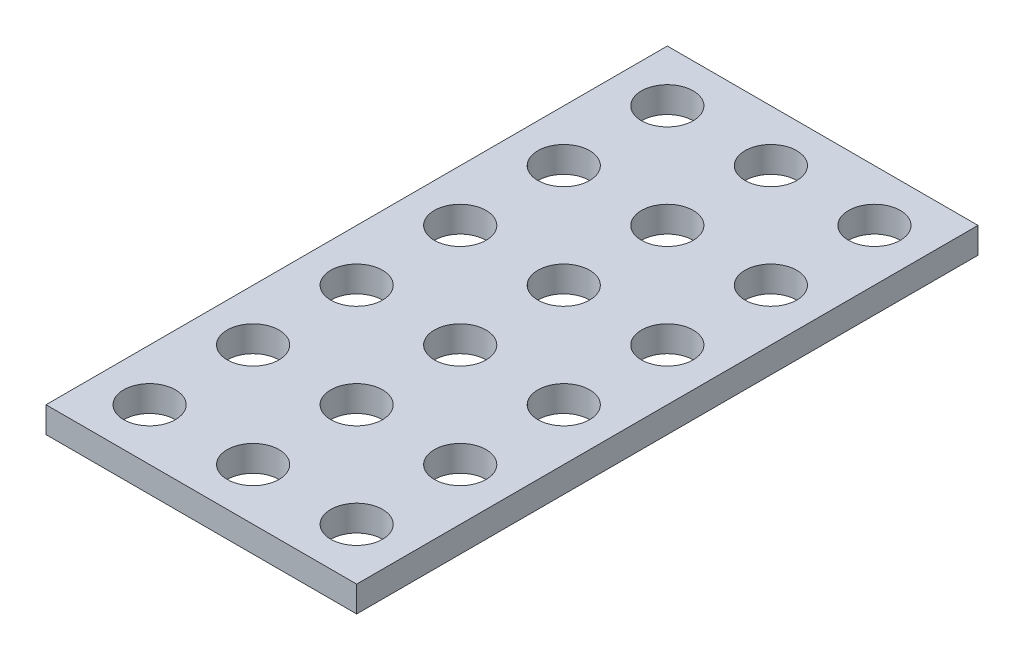
ISO-10303-21;
HEADER;
FILE_DESCRIPTION(('STEP AP214'),'2;1');
FILE_NAME('part.step','',(''),(''),'','','');
FILE_SCHEMA(('AUTOMOTIVE_DESIGN { 1 0 10303 214 1 1 1 1 }'));
ENDSEC;
DATA;
#1=APPLICATION_CONTEXT('core data for automotive mechanical design processes');
#2=APPLICATION_PROTOCOL_DEFINITION('international standard','automotive_design',2000,#1);
#3=PRODUCT_CONTEXT('',#1,'mechanical');
#4=PRODUCT('Part','Part','',(#3));
#5=PRODUCT_RELATED_PRODUCT_CATEGORY('part','',(#4));
#6=PRODUCT_DEFINITION_FORMATION('','',#4);
#7=PRODUCT_DEFINITION_CONTEXT('part definition',#1,'design');
#8=PRODUCT_DEFINITION('design','',#6,#7);
#9=PRODUCT_DEFINITION_SHAPE('','',#8);
#10=(LENGTH_UNIT() NAMED_UNIT(*) SI_UNIT(.MILLI.,.METRE.));
#11=(NAMED_UNIT(*) PLANE_ANGLE_UNIT() SI_UNIT($,.RADIAN.));
#12=(NAMED_UNIT(*) SI_UNIT($,.STERADIAN.) SOLID_ANGLE_UNIT());
#13=UNCERTAINTY_MEASURE_WITH_UNIT(LENGTH_MEASURE(1.E-05),#10,'distance_accuracy_value','');
#14=(GEOMETRIC_REPRESENTATION_CONTEXT(3) GLOBAL_UNCERTAINTY_ASSIGNED_CONTEXT((#13)) GLOBAL_UNIT_ASSIGNED_CONTEXT((#10,
#11,#12)) REPRESENTATION_CONTEXT('',''));
#15=CARTESIAN_POINT('',(0.,0.,0.));
#16=DIRECTION('',(0.,0.,1.));
#17=DIRECTION('',(1.,0.,0.));
#18=AXIS2_PLACEMENT_3D('',#15,#16,#17);
#19=CARTESIAN_POINT('',(8.,0.,20.));
#20=DIRECTION('',(0.,1.,0.));
#21=DIRECTION('',(0.,0.,1.));
#22=AXIS2_PLACEMENT_3D('',#19,#20,#21);
#23=CYLINDRICAL_SURFACE('',#22,2.);
#24=CARTESIAN_POINT('',(8.,0.,20.));
#25=DIRECTION('',(0.,1.,0.));
#26=DIRECTION('',(0.,0.,1.));
#27=AXIS2_PLACEMENT_3D('',#24,#25,#26);
#28=CIRCLE('',#27,2.);
#29=CARTESIAN_POINT('',(8.,0.,22.));
#30=VERTEX_POINT('',#29);
#31=EDGE_CURVE('E47',#30,#30,#28,.T.);
#32=ORIENTED_EDGE('',*,*,#31,.F.);
#33=EDGE_LOOP('',(#32));
#34=FACE_BOUND('',#33,.T.);
#35=CARTESIAN_POINT('',(8.,2.,20.));
#36=DIRECTION('',(0.,1.,0.));
#37=DIRECTION('',(0.,0.,1.));
#38=AXIS2_PLACEMENT_3D('',#35,#36,#37);
#39=CIRCLE('',#38,2.);
#40=CARTESIAN_POINT('',(8.,2.,22.));
#41=VERTEX_POINT('',#40);
#42=EDGE_CURVE('E11',#41,#41,#39,.T.);
#43=ORIENTED_EDGE('',*,*,#42,.T.);
#44=EDGE_LOOP('',(#43));
#45=FACE_BOUND('',#44,.T.);
#46=ADVANCED_FACE('F39',(#34,#45),#23,.F.);
#47=CARTESIAN_POINT('',(0.,0.,20.));
#48=DIRECTION('',(0.,1.,0.));
#49=DIRECTION('',(0.,0.,1.));
#50=AXIS2_PLACEMENT_3D('',#47,#48,#49);
#51=CYLINDRICAL_SURFACE('',#50,2.);
#52=CARTESIAN_POINT('',(0.,0.,20.));
#53=DIRECTION('',(0.,1.,0.));
#54=DIRECTION('',(0.,0.,1.));
#55=AXIS2_PLACEMENT_3D('',#52,#53,#54);
#56=CIRCLE('',#55,2.);
#57=CARTESIAN_POINT('',(0.,0.,22.));
#58=VERTEX_POINT('',#57);
#59=EDGE_CURVE('E201',#58,#58,#56,.T.);
#60=ORIENTED_EDGE('',*,*,#59,.F.);
#61=EDGE_LOOP('',(#60));
#62=FACE_BOUND('',#61,.T.);
#63=CARTESIAN_POINT('',(0.,2.,20.));
#64=DIRECTION('',(0.,1.,0.));
#65=DIRECTION('',(0.,0.,1.));
#66=AXIS2_PLACEMENT_3D('',#63,#64,#65);
#67=CIRCLE('',#66,2.);
#68=CARTESIAN_POINT('',(0.,2.,22.));
#69=VERTEX_POINT('',#68);
#70=EDGE_CURVE('E204',#69,#69,#67,.T.);
#71=ORIENTED_EDGE('',*,*,#70,.T.);
#72=EDGE_LOOP('',(#71));
#73=FACE_BOUND('',#72,.T.);
#74=ADVANCED_FACE('F213',(#62,#73),#51,.F.);
#75=CARTESIAN_POINT('',(-8.,0.,20.));
#76=DIRECTION('',(0.,1.,0.));
#77=DIRECTION('',(0.,0.,1.));
#78=AXIS2_PLACEMENT_3D('',#75,#76,#77);
#79=CYLINDRICAL_SURFACE('',#78,2.);
#80=CARTESIAN_POINT('',(-8.,0.,20.));
#81=DIRECTION('',(0.,1.,0.));
#82=DIRECTION('',(0.,0.,1.));
#83=AXIS2_PLACEMENT_3D('',#80,#81,#82);
#84=CIRCLE('',#83,2.);
#85=CARTESIAN_POINT('',(-8.,0.,22.));
#86=VERTEX_POINT('',#85);
#87=EDGE_CURVE('E195',#86,#86,#84,.T.);
#88=ORIENTED_EDGE('',*,*,#87,.F.);
#89=EDGE_LOOP('',(#88));
#90=FACE_BOUND('',#89,.T.);
#91=CARTESIAN_POINT('',(-8.,2.,20.));
#92=DIRECTION('',(0.,1.,0.));
#93=DIRECTION('',(0.,0.,1.));
#94=AXIS2_PLACEMENT_3D('',#91,#92,#93);
#95=CIRCLE('',#94,2.);
#96=CARTESIAN_POINT('',(-8.,2.,22.));
#97=VERTEX_POINT('',#96);
#98=EDGE_CURVE('E198',#97,#97,#95,.T.);
#99=ORIENTED_EDGE('',*,*,#98,.T.);
#100=EDGE_LOOP('',(#99));
#101=FACE_BOUND('',#100,.T.);
#102=ADVANCED_FACE('F292',(#90,#101),#79,.F.);
#103=CARTESIAN_POINT('',(8.,0.,12.));
#104=DIRECTION('',(0.,1.,0.));
#105=DIRECTION('',(0.,0.,1.));
#106=AXIS2_PLACEMENT_3D('',#103,#104,#105);
#107=CYLINDRICAL_SURFACE('',#106,2.);
#108=CARTESIAN_POINT('',(8.,0.,12.));
#109=DIRECTION('',(0.,1.,0.));
#110=DIRECTION('',(0.,0.,1.));
#111=AXIS2_PLACEMENT_3D('',#108,#109,#110);
#112=CIRCLE('',#111,2.);
#113=CARTESIAN_POINT('',(8.,0.,14.));
#114=VERTEX_POINT('',#113);
#115=EDGE_CURVE('E189',#114,#114,#112,.T.);
#116=ORIENTED_EDGE('',*,*,#115,.F.);
#117=EDGE_LOOP('',(#116));
#118=FACE_BOUND('',#117,.T.);
#119=CARTESIAN_POINT('',(8.,2.,12.));
#120=DIRECTION('',(0.,1.,0.));
#121=DIRECTION('',(0.,0.,1.));
#122=AXIS2_PLACEMENT_3D('',#119,#120,#121);
#123=CIRCLE('',#122,2.);
#124=CARTESIAN_POINT('',(8.,2.,14.));
#125=VERTEX_POINT('',#124);
#126=EDGE_CURVE('E192',#125,#125,#123,.T.);
#127=ORIENTED_EDGE('',*,*,#126,.T.);
#128=EDGE_LOOP('',(#127));
#129=FACE_BOUND('',#128,.T.);
#130=ADVANCED_FACE('F288',(#118,#129),#107,.F.);
#131=CARTESIAN_POINT('',(0.,0.,12.));
#132=DIRECTION('',(0.,1.,0.));
#133=DIRECTION('',(0.,0.,1.));
#134=AXIS2_PLACEMENT_3D('',#131,#132,#133);
#135=CYLINDRICAL_SURFACE('',#134,2.);
#136=CARTESIAN_POINT('',(0.,0.,12.));
#137=DIRECTION('',(0.,1.,0.));
#138=DIRECTION('',(0.,0.,1.));
#139=AXIS2_PLACEMENT_3D('',#136,#137,#138);
#140=CIRCLE('',#139,2.);
#141=CARTESIAN_POINT('',(0.,0.,14.));
#142=VERTEX_POINT('',#141);
#143=EDGE_CURVE('E183',#142,#142,#140,.T.);
#144=ORIENTED_EDGE('',*,*,#143,.F.);
#145=EDGE_LOOP('',(#144));
#146=FACE_BOUND('',#145,.T.);
#147=CARTESIAN_POINT('',(0.,2.,12.));
#148=DIRECTION('',(0.,1.,0.));
#149=DIRECTION('',(0.,0.,1.));
#150=AXIS2_PLACEMENT_3D('',#147,#148,#149);
#151=CIRCLE('',#150,2.);
#152=CARTESIAN_POINT('',(0.,2.,14.));
#153=VERTEX_POINT('',#152);
#154=EDGE_CURVE('E186',#153,#153,#151,.T.);
#155=ORIENTED_EDGE('',*,*,#154,.T.);
#156=EDGE_LOOP('',(#155));
#157=FACE_BOUND('',#156,.T.);
#158=ADVANCED_FACE('F284',(#146,#157),#135,.F.);
#159=CARTESIAN_POINT('',(-8.,0.,12.));
#160=DIRECTION('',(0.,1.,0.));
#161=DIRECTION('',(0.,0.,1.));
#162=AXIS2_PLACEMENT_3D('',#159,#160,#161);
#163=CYLINDRICAL_SURFACE('',#162,2.);
#164=CARTESIAN_POINT('',(-8.,0.,12.));
#165=DIRECTION('',(0.,1.,0.));
#166=DIRECTION('',(0.,0.,1.));
#167=AXIS2_PLACEMENT_3D('',#164,#165,#166);
#168=CIRCLE('',#167,2.);
#169=CARTESIAN_POINT('',(-8.,0.,14.));
#170=VERTEX_POINT('',#169);
#171=EDGE_CURVE('E177',#170,#170,#168,.T.);
#172=ORIENTED_EDGE('',*,*,#171,.F.);
#173=EDGE_LOOP('',(#172));
#174=FACE_BOUND('',#173,.T.);
#175=CARTESIAN_POINT('',(-8.,2.,12.));
#176=DIRECTION('',(0.,1.,0.));
#177=DIRECTION('',(0.,0.,1.));
#178=AXIS2_PLACEMENT_3D('',#175,#176,#177);
#179=CIRCLE('',#178,2.);
#180=CARTESIAN_POINT('',(-8.,2.,14.));
#181=VERTEX_POINT('',#180);
#182=EDGE_CURVE('E180',#181,#181,#179,.T.);
#183=ORIENTED_EDGE('',*,*,#182,.T.);
#184=EDGE_LOOP('',(#183));
#185=FACE_BOUND('',#184,.T.);
#186=ADVANCED_FACE('F280',(#174,#185),#163,.F.);
#187=CARTESIAN_POINT('',(8.,0.,4.));
#188=DIRECTION('',(0.,1.,0.));
#189=DIRECTION('',(0.,0.,1.));
#190=AXIS2_PLACEMENT_3D('',#187,#188,#189);
#191=CYLINDRICAL_SURFACE('',#190,2.);
#192=CARTESIAN_POINT('',(8.,0.,4.));
#193=DIRECTION('',(0.,1.,0.));
#194=DIRECTION('',(0.,0.,1.));
#195=AXIS2_PLACEMENT_3D('',#192,#193,#194);
#196=CIRCLE('',#195,2.);
#197=CARTESIAN_POINT('',(8.,0.,6.));
#198=VERTEX_POINT('',#197);
#199=EDGE_CURVE('E171',#198,#198,#196,.T.);
#200=ORIENTED_EDGE('',*,*,#199,.F.);
#201=EDGE_LOOP('',(#200));
#202=FACE_BOUND('',#201,.T.);
#203=CARTESIAN_POINT('',(8.,2.,4.));
#204=DIRECTION('',(0.,1.,0.));
#205=DIRECTION('',(0.,0.,1.));
#206=AXIS2_PLACEMENT_3D('',#203,#204,#205);
#207=CIRCLE('',#206,2.);
#208=CARTESIAN_POINT('',(8.,2.,6.));
#209=VERTEX_POINT('',#208);
#210=EDGE_CURVE('E174',#209,#209,#207,.T.);
#211=ORIENTED_EDGE('',*,*,#210,.T.);
#212=EDGE_LOOP('',(#211));
#213=FACE_BOUND('',#212,.T.);
#214=ADVANCED_FACE('F276',(#202,#213),#191,.F.);
#215=CARTESIAN_POINT('',(0.,0.,4.));
#216=DIRECTION('',(0.,1.,0.));
#217=DIRECTION('',(0.,0.,1.));
#218=AXIS2_PLACEMENT_3D('',#215,#216,#217);
#219=CYLINDRICAL_SURFACE('',#218,2.);
#220=CARTESIAN_POINT('',(0.,0.,4.));
#221=DIRECTION('',(0.,1.,0.));
#222=DIRECTION('',(0.,0.,1.));
#223=AXIS2_PLACEMENT_3D('',#220,#221,#222);
#224=CIRCLE('',#223,2.);
#225=CARTESIAN_POINT('',(0.,0.,6.));
#226=VERTEX_POINT('',#225);
#227=EDGE_CURVE('E165',#226,#226,#224,.T.);
#228=ORIENTED_EDGE('',*,*,#227,.F.);
#229=EDGE_LOOP('',(#228));
#230=FACE_BOUND('',#229,.T.);
#231=CARTESIAN_POINT('',(0.,2.,4.));
#232=DIRECTION('',(0.,1.,0.));
#233=DIRECTION('',(0.,0.,1.));
#234=AXIS2_PLACEMENT_3D('',#231,#232,#233);
#235=CIRCLE('',#234,2.);
#236=CARTESIAN_POINT('',(0.,2.,6.));
#237=VERTEX_POINT('',#236);
#238=EDGE_CURVE('E168',#237,#237,#235,.T.);
#239=ORIENTED_EDGE('',*,*,#238,.T.);
#240=EDGE_LOOP('',(#239));
#241=FACE_BOUND('',#240,.T.);
#242=ADVANCED_FACE('F272',(#230,#241),#219,.F.);
#243=CARTESIAN_POINT('',(-8.,0.,4.));
#244=DIRECTION('',(0.,1.,0.));
#245=DIRECTION('',(0.,0.,1.));
#246=AXIS2_PLACEMENT_3D('',#243,#244,#245);
#247=CYLINDRICAL_SURFACE('',#246,2.);
#248=CARTESIAN_POINT('',(-8.,0.,4.));
#249=DIRECTION('',(0.,1.,0.));
#250=DIRECTION('',(0.,0.,1.));
#251=AXIS2_PLACEMENT_3D('',#248,#249,#250);
#252=CIRCLE('',#251,2.);
#253=CARTESIAN_POINT('',(-8.,0.,6.));
#254=VERTEX_POINT('',#253);
#255=EDGE_CURVE('E159',#254,#254,#252,.T.);
#256=ORIENTED_EDGE('',*,*,#255,.F.);
#257=EDGE_LOOP('',(#256));
#258=FACE_BOUND('',#257,.T.);
#259=CARTESIAN_POINT('',(-8.,2.,4.));
#260=DIRECTION('',(0.,1.,0.));
#261=DIRECTION('',(0.,0.,1.));
#262=AXIS2_PLACEMENT_3D('',#259,#260,#261);
#263=CIRCLE('',#262,2.);
#264=CARTESIAN_POINT('',(-8.,2.,6.));
#265=VERTEX_POINT('',#264);
#266=EDGE_CURVE('E162',#265,#265,#263,.T.);
#267=ORIENTED_EDGE('',*,*,#266,.T.);
#268=EDGE_LOOP('',(#267));
#269=FACE_BOUND('',#268,.T.);
#270=ADVANCED_FACE('F268',(#258,#269),#247,.F.);
#271=CARTESIAN_POINT('',(8.,0.,-4.));
#272=DIRECTION('',(0.,1.,0.));
#273=DIRECTION('',(0.,0.,1.));
#274=AXIS2_PLACEMENT_3D('',#271,#272,#273);
#275=CYLINDRICAL_SURFACE('',#274,2.);
#276=CARTESIAN_POINT('',(8.,0.,-4.));
#277=DIRECTION('',(0.,1.,0.));
#278=DIRECTION('',(0.,0.,1.));
#279=AXIS2_PLACEMENT_3D('',#276,#277,#278);
#280=CIRCLE('',#279,2.);
#281=CARTESIAN_POINT('',(8.,0.,-2.));
#282=VERTEX_POINT('',#281);
#283=EDGE_CURVE('E153',#282,#282,#280,.T.);
#284=ORIENTED_EDGE('',*,*,#283,.F.);
#285=EDGE_LOOP('',(#284));
#286=FACE_BOUND('',#285,.T.);
#287=CARTESIAN_POINT('',(8.,2.,-4.));
#288=DIRECTION('',(0.,1.,0.));
#289=DIRECTION('',(0.,0.,1.));
#290=AXIS2_PLACEMENT_3D('',#287,#288,#289);
#291=CIRCLE('',#290,2.);
#292=CARTESIAN_POINT('',(8.,2.,-2.));
#293=VERTEX_POINT('',#292);
#294=EDGE_CURVE('E156',#293,#293,#291,.T.);
#295=ORIENTED_EDGE('',*,*,#294,.T.);
#296=EDGE_LOOP('',(#295));
#297=FACE_BOUND('',#296,.T.);
#298=ADVANCED_FACE('F264',(#286,#297),#275,.F.);
#299=CARTESIAN_POINT('',(0.,0.,-4.));
#300=DIRECTION('',(0.,1.,0.));
#301=DIRECTION('',(0.,0.,1.));
#302=AXIS2_PLACEMENT_3D('',#299,#300,#301);
#303=CYLINDRICAL_SURFACE('',#302,2.);
#304=CARTESIAN_POINT('',(0.,0.,-4.));
#305=DIRECTION('',(0.,1.,0.));
#306=DIRECTION('',(0.,0.,1.));
#307=AXIS2_PLACEMENT_3D('',#304,#305,#306);
#308=CIRCLE('',#307,2.);
#309=CARTESIAN_POINT('',(0.,0.,-2.));
#310=VERTEX_POINT('',#309);
#311=EDGE_CURVE('E147',#310,#310,#308,.T.);
#312=ORIENTED_EDGE('',*,*,#311,.F.);
#313=EDGE_LOOP('',(#312));
#314=FACE_BOUND('',#313,.T.);
#315=CARTESIAN_POINT('',(0.,2.,-4.));
#316=DIRECTION('',(0.,1.,0.));
#317=DIRECTION('',(0.,0.,1.));
#318=AXIS2_PLACEMENT_3D('',#315,#316,#317);
#319=CIRCLE('',#318,2.);
#320=CARTESIAN_POINT('',(0.,2.,-2.));
#321=VERTEX_POINT('',#320);
#322=EDGE_CURVE('E150',#321,#321,#319,.T.);
#323=ORIENTED_EDGE('',*,*,#322,.T.);
#324=EDGE_LOOP('',(#323));
#325=FACE_BOUND('',#324,.T.);
#326=ADVANCED_FACE('F260',(#314,#325),#303,.F.);
#327=CARTESIAN_POINT('',(-8.00000000000001,0.,-4.));
#328=DIRECTION('',(0.,1.,0.));
#329=DIRECTION('',(0.,0.,1.));
#330=AXIS2_PLACEMENT_3D('',#327,#328,#329);
#331=CYLINDRICAL_SURFACE('',#330,2.);
#332=CARTESIAN_POINT('',(-8.00000000000001,0.,-4.));
#333=DIRECTION('',(0.,1.,0.));
#334=DIRECTION('',(0.,0.,1.));
#335=AXIS2_PLACEMENT_3D('',#332,#333,#334);
#336=CIRCLE('',#335,2.);
#337=CARTESIAN_POINT('',(-8.00000000000001,0.,-2.));
#338=VERTEX_POINT('',#337);
#339=EDGE_CURVE('E141',#338,#338,#336,.T.);
#340=ORIENTED_EDGE('',*,*,#339,.F.);
#341=EDGE_LOOP('',(#340));
#342=FACE_BOUND('',#341,.T.);
#343=CARTESIAN_POINT('',(-8.00000000000001,2.,-4.));
#344=DIRECTION('',(0.,1.,0.));
#345=DIRECTION('',(0.,0.,1.));
#346=AXIS2_PLACEMENT_3D('',#343,#344,#345);
#347=CIRCLE('',#346,2.);
#348=CARTESIAN_POINT('',(-8.00000000000001,2.,-2.));
#349=VERTEX_POINT('',#348);
#350=EDGE_CURVE('E144',#349,#349,#347,.T.);
#351=ORIENTED_EDGE('',*,*,#350,.T.);
#352=EDGE_LOOP('',(#351));
#353=FACE_BOUND('',#352,.T.);
#354=ADVANCED_FACE('F256',(#342,#353),#331,.F.);
#355=CARTESIAN_POINT('',(7.99999999999999,0.,-12.));
#356=DIRECTION('',(0.,1.,0.));
#357=DIRECTION('',(0.,0.,1.));
#358=AXIS2_PLACEMENT_3D('',#355,#356,#357);
#359=CYLINDRICAL_SURFACE('',#358,2.);
#360=CARTESIAN_POINT('',(7.99999999999999,0.,-12.));
#361=DIRECTION('',(0.,1.,0.));
#362=DIRECTION('',(0.,0.,1.));
#363=AXIS2_PLACEMENT_3D('',#360,#361,#362);
#364=CIRCLE('',#363,2.);
#365=CARTESIAN_POINT('',(7.99999999999999,0.,-10.));
#366=VERTEX_POINT('',#365);
#367=EDGE_CURVE('E135',#366,#366,#364,.T.);
#368=ORIENTED_EDGE('',*,*,#367,.F.);
#369=EDGE_LOOP('',(#368));
#370=FACE_BOUND('',#369,.T.);
#371=CARTESIAN_POINT('',(7.99999999999999,2.,-12.));
#372=DIRECTION('',(0.,1.,0.));
#373=DIRECTION('',(0.,0.,1.));
#374=AXIS2_PLACEMENT_3D('',#371,#372,#373);
#375=CIRCLE('',#374,2.);
#376=CARTESIAN_POINT('',(7.99999999999999,2.,-10.));
#377=VERTEX_POINT('',#376);
#378=EDGE_CURVE('E138',#377,#377,#375,.T.);
#379=ORIENTED_EDGE('',*,*,#378,.T.);
#380=EDGE_LOOP('',(#379));
#381=FACE_BOUND('',#380,.T.);
#382=ADVANCED_FACE('F252',(#370,#381),#359,.F.);
#383=CARTESIAN_POINT('',(0.,0.,-12.));
#384=DIRECTION('',(0.,1.,0.));
#385=DIRECTION('',(0.,0.,1.));
#386=AXIS2_PLACEMENT_3D('',#383,#384,#385);
#387=CYLINDRICAL_SURFACE('',#386,2.);
#388=CARTESIAN_POINT('',(0.,0.,-12.));
#389=DIRECTION('',(0.,1.,0.));
#390=DIRECTION('',(0.,0.,1.));
#391=AXIS2_PLACEMENT_3D('',#388,#389,#390);
#392=CIRCLE('',#391,2.);
#393=CARTESIAN_POINT('',(0.,0.,-10.));
#394=VERTEX_POINT('',#393);
#395=EDGE_CURVE('E129',#394,#394,#392,.T.);
#396=ORIENTED_EDGE('',*,*,#395,.F.);
#397=EDGE_LOOP('',(#396));
#398=FACE_BOUND('',#397,.T.);
#399=CARTESIAN_POINT('',(0.,2.,-12.));
#400=DIRECTION('',(0.,1.,0.));
#401=DIRECTION('',(0.,0.,1.));
#402=AXIS2_PLACEMENT_3D('',#399,#400,#401);
#403=CIRCLE('',#402,2.);
#404=CARTESIAN_POINT('',(0.,2.,-10.));
#405=VERTEX_POINT('',#404);
#406=EDGE_CURVE('E132',#405,#405,#403,.T.);
#407=ORIENTED_EDGE('',*,*,#406,.T.);
#408=EDGE_LOOP('',(#407));
#409=FACE_BOUND('',#408,.T.);
#410=ADVANCED_FACE('F248',(#398,#409),#387,.F.);
#411=CARTESIAN_POINT('',(-8.00000000000001,0.,-12.));
#412=DIRECTION('',(0.,1.,0.));
#413=DIRECTION('',(0.,0.,1.));
#414=AXIS2_PLACEMENT_3D('',#411,#412,#413);
#415=CYLINDRICAL_SURFACE('',#414,2.);
#416=CARTESIAN_POINT('',(-8.00000000000001,0.,-12.));
#417=DIRECTION('',(0.,1.,0.));
#418=DIRECTION('',(0.,0.,1.));
#419=AXIS2_PLACEMENT_3D('',#416,#417,#418);
#420=CIRCLE('',#419,2.);
#421=CARTESIAN_POINT('',(-8.00000000000001,0.,-10.));
#422=VERTEX_POINT('',#421);
#423=EDGE_CURVE('E123',#422,#422,#420,.T.);
#424=ORIENTED_EDGE('',*,*,#423,.F.);
#425=EDGE_LOOP('',(#424));
#426=FACE_BOUND('',#425,.T.);
#427=CARTESIAN_POINT('',(-8.00000000000001,2.,-12.));
#428=DIRECTION('',(0.,1.,0.));
#429=DIRECTION('',(0.,0.,1.));
#430=AXIS2_PLACEMENT_3D('',#427,#428,#429);
#431=CIRCLE('',#430,2.);
#432=CARTESIAN_POINT('',(-8.00000000000001,2.,-10.));
#433=VERTEX_POINT('',#432);
#434=EDGE_CURVE('E126',#433,#433,#431,.T.);
#435=ORIENTED_EDGE('',*,*,#434,.T.);
#436=EDGE_LOOP('',(#435));
#437=FACE_BOUND('',#436,.T.);
#438=ADVANCED_FACE('F244',(#426,#437),#415,.F.);
#439=CARTESIAN_POINT('',(7.99999999999999,0.,-20.));
#440=DIRECTION('',(0.,1.,0.));
#441=DIRECTION('',(0.,0.,1.));
#442=AXIS2_PLACEMENT_3D('',#439,#440,#441);
#443=CYLINDRICAL_SURFACE('',#442,2.);
#444=CARTESIAN_POINT('',(7.99999999999999,0.,-20.));
#445=DIRECTION('',(0.,1.,0.));
#446=DIRECTION('',(0.,0.,1.));
#447=AXIS2_PLACEMENT_3D('',#444,#445,#446);
#448=CIRCLE('',#447,2.);
#449=CARTESIAN_POINT('',(7.99999999999999,0.,-18.));
#450=VERTEX_POINT('',#449);
#451=EDGE_CURVE('E117',#450,#450,#448,.T.);
#452=ORIENTED_EDGE('',*,*,#451,.F.);
#453=EDGE_LOOP('',(#452));
#454=FACE_BOUND('',#453,.T.);
#455=CARTESIAN_POINT('',(7.99999999999999,2.,-20.));
#456=DIRECTION('',(0.,1.,0.));
#457=DIRECTION('',(0.,0.,1.));
#458=AXIS2_PLACEMENT_3D('',#455,#456,#457);
#459=CIRCLE('',#458,2.);
#460=CARTESIAN_POINT('',(7.99999999999999,2.,-18.));
#461=VERTEX_POINT('',#460);
#462=EDGE_CURVE('E120',#461,#461,#459,.T.);
#463=ORIENTED_EDGE('',*,*,#462,.T.);
#464=EDGE_LOOP('',(#463));
#465=FACE_BOUND('',#464,.T.);
#466=ADVANCED_FACE('F240',(#454,#465),#443,.F.);
#467=CARTESIAN_POINT('',(12.,2.,-24.));
#468=DIRECTION('',(-1.,0.,0.));
#469=DIRECTION('',(0.,0.,1.));
#470=AXIS2_PLACEMENT_3D('',#467,#468,#469);
#471=PLANE('',#470);
#472=DIRECTION('',(0.,0.,-1.));
#473=VECTOR('',#472,1.);
#474=CARTESIAN_POINT('',(12.,0.,-24.));
#475=LINE('',#474,#473);
#476=CARTESIAN_POINT('',(12.,0.,24.));
#477=VERTEX_POINT('',#476);
#478=CARTESIAN_POINT('',(12.,0.,-24.));
#479=VERTEX_POINT('',#478);
#480=EDGE_CURVE('E107',#477,#479,#475,.T.);
#481=ORIENTED_EDGE('',*,*,#480,.T.);
#482=DIRECTION('',(0.,-1.,0.));
#483=VECTOR('',#482,1.);
#484=CARTESIAN_POINT('',(12.,2.,-24.));
#485=LINE('',#484,#483);
#486=CARTESIAN_POINT('',(12.,2.,-24.));
#487=VERTEX_POINT('',#486);
#488=EDGE_CURVE('E98',#487,#479,#485,.T.);
#489=ORIENTED_EDGE('',*,*,#488,.F.);
#490=DIRECTION('',(0.,0.,-1.));
#491=VECTOR('',#490,1.);
#492=CARTESIAN_POINT('',(12.,2.,-24.));
#493=LINE('',#492,#491);
#494=CARTESIAN_POINT('',(12.,2.,24.));
#495=VERTEX_POINT('',#494);
#496=EDGE_CURVE('E92',#495,#487,#493,.T.);
#497=ORIENTED_EDGE('',*,*,#496,.F.);
#498=DIRECTION('',(0.,-1.,0.));
#499=VECTOR('',#498,1.);
#500=CARTESIAN_POINT('',(12.,2.,24.));
#501=LINE('',#500,#499);
#502=EDGE_CURVE('E103',#495,#477,#501,.T.);
#503=ORIENTED_EDGE('',*,*,#502,.T.);
#504=EDGE_LOOP('',(#481,#489,#497,#503));
#505=FACE_BOUND('',#504,.T.);
#506=ADVANCED_FACE('F237',(#505),#471,.F.);
#507=CARTESIAN_POINT('',(-12.,2.,-24.));
#508=DIRECTION('',(0.,0.,1.));
#509=DIRECTION('',(1.,0.,0.));
#510=AXIS2_PLACEMENT_3D('',#507,#508,#509);
#511=PLANE('',#510);
#512=DIRECTION('',(-1.,0.,0.));
#513=VECTOR('',#512,1.);
#514=CARTESIAN_POINT('',(-12.,0.,-24.));
#515=LINE('',#514,#513);
#516=CARTESIAN_POINT('',(-12.,0.,-24.));
#517=VERTEX_POINT('',#516);
#518=EDGE_CURVE('E97',#479,#517,#515,.T.);
#519=ORIENTED_EDGE('',*,*,#518,.T.);
#520=DIRECTION('',(0.,-1.,0.));
#521=VECTOR('',#520,1.);
#522=CARTESIAN_POINT('',(-12.,2.,-24.));
#523=LINE('',#522,#521);
#524=CARTESIAN_POINT('',(-12.,2.,-24.));
#525=VERTEX_POINT('',#524);
#526=EDGE_CURVE('E95',#525,#517,#523,.T.);
#527=ORIENTED_EDGE('',*,*,#526,.F.);
#528=DIRECTION('',(-1.,0.,0.));
#529=VECTOR('',#528,1.);
#530=CARTESIAN_POINT('',(-12.,2.,-24.));
#531=LINE('',#530,#529);
#532=EDGE_CURVE('E86',#487,#525,#531,.T.);
#533=ORIENTED_EDGE('',*,*,#532,.F.);
#534=ORIENTED_EDGE('',*,*,#488,.T.);
#535=EDGE_LOOP('',(#519,#527,#533,#534));
#536=FACE_BOUND('',#535,.T.);
#537=ADVANCED_FACE('F96',(#536),#511,.F.);
#538=CARTESIAN_POINT('',(-12.,2.,-24.));
#539=DIRECTION('',(1.,0.,0.));
#540=DIRECTION('',(0.,0.,-1.));
#541=AXIS2_PLACEMENT_3D('',#538,#539,#540);
#542=PLANE('',#541);
#543=DIRECTION('',(0.,0.,1.));
#544=VECTOR('',#543,1.);
#545=CARTESIAN_POINT('',(-12.,0.,-24.));
#546=LINE('',#545,#544);
#547=CARTESIAN_POINT('',(-12.,0.,24.));
#548=VERTEX_POINT('',#547);
#549=EDGE_CURVE('E72',#517,#548,#546,.T.);
#550=ORIENTED_EDGE('',*,*,#549,.T.);
#551=DIRECTION('',(0.,-1.,0.));
#552=VECTOR('',#551,1.);
#553=CARTESIAN_POINT('',(-12.,2.,24.));
#554=LINE('',#553,#552);
#555=CARTESIAN_POINT('',(-12.,2.,24.));
#556=VERTEX_POINT('',#555);
#557=EDGE_CURVE('E99',#556,#548,#554,.T.);
#558=ORIENTED_EDGE('',*,*,#557,.F.);
#559=DIRECTION('',(0.,0.,1.));
#560=VECTOR('',#559,1.);
#561=CARTESIAN_POINT('',(-12.,2.,-24.));
#562=LINE('',#561,#560);
#563=EDGE_CURVE('E90',#525,#556,#562,.T.);
#564=ORIENTED_EDGE('',*,*,#563,.F.);
#565=ORIENTED_EDGE('',*,*,#526,.T.);
#566=EDGE_LOOP('',(#550,#558,#564,#565));
#567=FACE_BOUND('',#566,.T.);
#568=ADVANCED_FACE('F101',(#567),#542,.F.);
#569=CARTESIAN_POINT('',(-12.,2.,24.));
#570=DIRECTION('',(0.,0.,-1.));
#571=DIRECTION('',(-1.,0.,0.));
#572=AXIS2_PLACEMENT_3D('',#569,#570,#571);
#573=PLANE('',#572);
#574=DIRECTION('',(1.,0.,0.));
#575=VECTOR('',#574,1.);
#576=CARTESIAN_POINT('',(-12.,0.,24.));
#577=LINE('',#576,#575);
#578=EDGE_CURVE('E78',#548,#477,#577,.T.);
#579=ORIENTED_EDGE('',*,*,#578,.T.);
#580=ORIENTED_EDGE('',*,*,#502,.F.);
#581=DIRECTION('',(1.,0.,0.));
#582=VECTOR('',#581,1.);
#583=CARTESIAN_POINT('',(-12.,2.,24.));
#584=LINE('',#583,#582);
#585=EDGE_CURVE('E55',#556,#495,#584,.T.);
#586=ORIENTED_EDGE('',*,*,#585,.F.);
#587=ORIENTED_EDGE('',*,*,#557,.T.);
#588=EDGE_LOOP('',(#579,#580,#586,#587));
#589=FACE_BOUND('',#588,.T.);
#590=ADVANCED_FACE('F217',(#589),#573,.F.);
#591=CARTESIAN_POINT('',(0.,2.,0.));
#592=DIRECTION('',(0.,1.,0.));
#593=DIRECTION('',(0.,0.,1.));
#594=AXIS2_PLACEMENT_3D('',#591,#592,#593);
#595=PLANE('',#594);
#596=CARTESIAN_POINT('',(0.,2.,-20.));
#597=DIRECTION('',(0.,1.,0.));
#598=DIRECTION('',(0.,0.,1.));
#599=AXIS2_PLACEMENT_3D('',#596,#597,#598);
#600=CIRCLE('',#599,2.);
#601=CARTESIAN_POINT('',(0.,2.,-18.));
#602=VERTEX_POINT('',#601);
#603=EDGE_CURVE('E449',#602,#602,#600,.T.);
#604=ORIENTED_EDGE('',*,*,#603,.F.);
#605=EDGE_LOOP('',(#604));
#606=FACE_BOUND('',#605,.T.);
#607=CARTESIAN_POINT('',(-8.00000000000001,2.,-20.));
#608=DIRECTION('',(0.,1.,0.));
#609=DIRECTION('',(0.,0.,1.));
#610=AXIS2_PLACEMENT_3D('',#607,#608,#609);
#611=CIRCLE('',#610,2.);
#612=CARTESIAN_POINT('',(-8.00000000000001,2.,-18.));
#613=VERTEX_POINT('',#612);
#614=EDGE_CURVE('E450',#613,#613,#611,.T.);
#615=ORIENTED_EDGE('',*,*,#614,.F.);
#616=EDGE_LOOP('',(#615));
#617=FACE_BOUND('',#616,.T.);
#618=ORIENTED_EDGE('',*,*,#496,.T.);
#619=ORIENTED_EDGE('',*,*,#532,.T.);
#620=ORIENTED_EDGE('',*,*,#563,.T.);
#621=ORIENTED_EDGE('',*,*,#585,.T.);
#622=EDGE_LOOP('',(#618,#619,#620,#621));
#623=FACE_BOUND('',#622,.T.);
#624=ORIENTED_EDGE('',*,*,#462,.F.);
#625=EDGE_LOOP('',(#624));
#626=FACE_BOUND('',#625,.T.);
#627=ORIENTED_EDGE('',*,*,#434,.F.);
#628=EDGE_LOOP('',(#627));
#629=FACE_BOUND('',#628,.T.);
#630=ORIENTED_EDGE('',*,*,#406,.F.);
#631=EDGE_LOOP('',(#630));
#632=FACE_BOUND('',#631,.T.);
#633=ORIENTED_EDGE('',*,*,#378,.F.);
#634=EDGE_LOOP('',(#633));
#635=FACE_BOUND('',#634,.T.);
#636=ORIENTED_EDGE('',*,*,#350,.F.);
#637=EDGE_LOOP('',(#636));
#638=FACE_BOUND('',#637,.T.);
#639=ORIENTED_EDGE('',*,*,#322,.F.);
#640=EDGE_LOOP('',(#639));
#641=FACE_BOUND('',#640,.T.);
#642=ORIENTED_EDGE('',*,*,#294,.F.);
#643=EDGE_LOOP('',(#642));
#644=FACE_BOUND('',#643,.T.);
#645=ORIENTED_EDGE('',*,*,#266,.F.);
#646=EDGE_LOOP('',(#645));
#647=FACE_BOUND('',#646,.T.);
#648=ORIENTED_EDGE('',*,*,#238,.F.);
#649=EDGE_LOOP('',(#648));
#650=FACE_BOUND('',#649,.T.);
#651=ORIENTED_EDGE('',*,*,#210,.F.);
#652=EDGE_LOOP('',(#651));
#653=FACE_BOUND('',#652,.T.);
#654=ORIENTED_EDGE('',*,*,#182,.F.);
#655=EDGE_LOOP('',(#654));
#656=FACE_BOUND('',#655,.T.);
#657=ORIENTED_EDGE('',*,*,#154,.F.);
#658=EDGE_LOOP('',(#657));
#659=FACE_BOUND('',#658,.T.);
#660=ORIENTED_EDGE('',*,*,#126,.F.);
#661=EDGE_LOOP('',(#660));
#662=FACE_BOUND('',#661,.T.);
#663=ORIENTED_EDGE('',*,*,#98,.F.);
#664=EDGE_LOOP('',(#663));
#665=FACE_BOUND('',#664,.T.);
#666=ORIENTED_EDGE('',*,*,#70,.F.);
#667=EDGE_LOOP('',(#666));
#668=FACE_BOUND('',#667,.T.);
#669=ORIENTED_EDGE('',*,*,#42,.F.);
#670=EDGE_LOOP('',(#669));
#671=FACE_BOUND('',#670,.T.);
#672=ADVANCED_FACE('F87',(#606,#617,#623,#626,#629,#632,#635,#638,#641,#644,#647,#650,#653,#656,
#659,#662,#665,#668,#671),#595,.T.);
#673=CARTESIAN_POINT('',(0.,0.,0.));
#674=DIRECTION('',(0.,1.,0.));
#675=DIRECTION('',(0.,0.,1.));
#676=AXIS2_PLACEMENT_3D('',#673,#674,#675);
#677=PLANE('',#676);
#678=CARTESIAN_POINT('',(0.,0.,-20.));
#679=DIRECTION('',(0.,1.,0.));
#680=DIRECTION('',(0.,0.,1.));
#681=AXIS2_PLACEMENT_3D('',#678,#679,#680);
#682=CIRCLE('',#681,2.);
#683=CARTESIAN_POINT('',(0.,0.,-18.));
#684=VERTEX_POINT('',#683);
#685=EDGE_CURVE('E447',#684,#684,#682,.T.);
#686=ORIENTED_EDGE('',*,*,#685,.T.);
#687=EDGE_LOOP('',(#686));
#688=FACE_BOUND('',#687,.T.);
#689=CARTESIAN_POINT('',(-8.00000000000001,0.,-20.));
#690=DIRECTION('',(0.,1.,0.));
#691=DIRECTION('',(0.,0.,1.));
#692=AXIS2_PLACEMENT_3D('',#689,#690,#691);
#693=CIRCLE('',#692,2.);
#694=CARTESIAN_POINT('',(-8.00000000000001,0.,-18.));
#695=VERTEX_POINT('',#694);
#696=EDGE_CURVE('E110',#695,#695,#693,.T.);
#697=ORIENTED_EDGE('',*,*,#696,.T.);
#698=EDGE_LOOP('',(#697));
#699=FACE_BOUND('',#698,.T.);
#700=ORIENTED_EDGE('',*,*,#480,.F.);
#701=ORIENTED_EDGE('',*,*,#578,.F.);
#702=ORIENTED_EDGE('',*,*,#549,.F.);
#703=ORIENTED_EDGE('',*,*,#518,.F.);
#704=EDGE_LOOP('',(#700,#701,#702,#703));
#705=FACE_BOUND('',#704,.T.);
#706=ORIENTED_EDGE('',*,*,#451,.T.);
#707=EDGE_LOOP('',(#706));
#708=FACE_BOUND('',#707,.T.);
#709=ORIENTED_EDGE('',*,*,#423,.T.);
#710=EDGE_LOOP('',(#709));
#711=FACE_BOUND('',#710,.T.);
#712=ORIENTED_EDGE('',*,*,#395,.T.);
#713=EDGE_LOOP('',(#712));
#714=FACE_BOUND('',#713,.T.);
#715=ORIENTED_EDGE('',*,*,#367,.T.);
#716=EDGE_LOOP('',(#715));
#717=FACE_BOUND('',#716,.T.);
#718=ORIENTED_EDGE('',*,*,#339,.T.);
#719=EDGE_LOOP('',(#718));
#720=FACE_BOUND('',#719,.T.);
#721=ORIENTED_EDGE('',*,*,#311,.T.);
#722=EDGE_LOOP('',(#721));
#723=FACE_BOUND('',#722,.T.);
#724=ORIENTED_EDGE('',*,*,#283,.T.);
#725=EDGE_LOOP('',(#724));
#726=FACE_BOUND('',#725,.T.);
#727=ORIENTED_EDGE('',*,*,#255,.T.);
#728=EDGE_LOOP('',(#727));
#729=FACE_BOUND('',#728,.T.);
#730=ORIENTED_EDGE('',*,*,#227,.T.);
#731=EDGE_LOOP('',(#730));
#732=FACE_BOUND('',#731,.T.);
#733=ORIENTED_EDGE('',*,*,#199,.T.);
#734=EDGE_LOOP('',(#733));
#735=FACE_BOUND('',#734,.T.);
#736=ORIENTED_EDGE('',*,*,#171,.T.);
#737=EDGE_LOOP('',(#736));
#738=FACE_BOUND('',#737,.T.);
#739=ORIENTED_EDGE('',*,*,#143,.T.);
#740=EDGE_LOOP('',(#739));
#741=FACE_BOUND('',#740,.T.);
#742=ORIENTED_EDGE('',*,*,#115,.T.);
#743=EDGE_LOOP('',(#742));
#744=FACE_BOUND('',#743,.T.);
#745=ORIENTED_EDGE('',*,*,#87,.T.);
#746=EDGE_LOOP('',(#745));
#747=FACE_BOUND('',#746,.T.);
#748=ORIENTED_EDGE('',*,*,#59,.T.);
#749=EDGE_LOOP('',(#748));
#750=FACE_BOUND('',#749,.T.);
#751=ORIENTED_EDGE('',*,*,#31,.T.);
#752=EDGE_LOOP('',(#751));
#753=FACE_BOUND('',#752,.T.);
#754=ADVANCED_FACE('F209',(#688,#699,#705,#708,#711,#714,#717,#720,#723,#726,#729,#732,#735,
#738,#741,#744,#747,#750,#753),#677,.F.);
#755=CARTESIAN_POINT('',(-8.00000000000001,0.,-20.));
#756=DIRECTION('',(0.,1.,0.));
#757=DIRECTION('',(0.,0.,1.));
#758=AXIS2_PLACEMENT_3D('',#755,#756,#757);
#759=CYLINDRICAL_SURFACE('',#758,2.);
#760=ORIENTED_EDGE('',*,*,#696,.F.);
#761=EDGE_LOOP('',(#760));
#762=FACE_BOUND('',#761,.T.);
#763=ORIENTED_EDGE('',*,*,#614,.T.);
#764=EDGE_LOOP('',(#763));
#765=FACE_BOUND('',#764,.T.);
#766=ADVANCED_FACE('F224',(#762,#765),#759,.F.);
#767=CARTESIAN_POINT('',(0.,0.,-20.));
#768=DIRECTION('',(0.,1.,0.));
#769=DIRECTION('',(0.,0.,1.));
#770=AXIS2_PLACEMENT_3D('',#767,#768,#769);
#771=CYLINDRICAL_SURFACE('',#770,2.);
#772=ORIENTED_EDGE('',*,*,#685,.F.);
#773=EDGE_LOOP('',(#772));
#774=FACE_BOUND('',#773,.T.);
#775=ORIENTED_EDGE('',*,*,#603,.T.);
#776=EDGE_LOOP('',(#775));
#777=FACE_BOUND('',#776,.T.);
#778=ADVANCED_FACE('F388',(#774,#777),#771,.F.);
#779=CLOSED_SHELL('',(#46,#74,#102,#130,#158,#186,#214,#242,#270,#298,#326,#354,#382,#410,#438,
#466,#506,#537,#568,#590,#672,#754,#766,#778));
#780=MANIFOLD_SOLID_BREP('B2',#779);
#781=ADVANCED_BREP_SHAPE_REPRESENTATION('',(#18,#780),#14);
#782=SHAPE_DEFINITION_REPRESENTATION(#9,#781);
ENDSEC;
END-ISO-10303-21;
